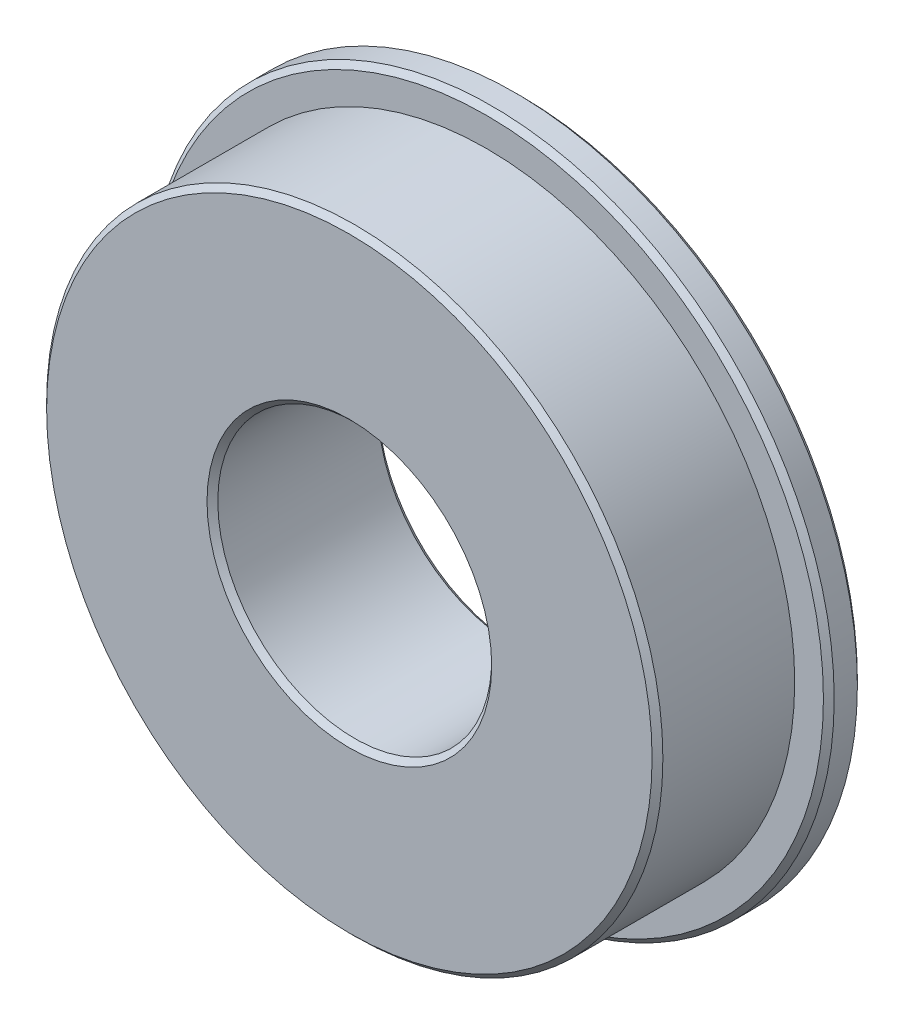
ISO-10303-21;
HEADER;
FILE_DESCRIPTION(('STEP AP214'),'2;1');
FILE_NAME('part.step','',(''),(''),'','','');
FILE_SCHEMA(('AUTOMOTIVE_DESIGN { 1 0 10303 214 1 1 1 1 }'));
ENDSEC;
DATA;
#1=APPLICATION_CONTEXT('core data for automotive mechanical design processes');
#2=APPLICATION_PROTOCOL_DEFINITION('international standard','automotive_design',2000,#1);
#3=PRODUCT_CONTEXT('',#1,'mechanical');
#4=PRODUCT('Part','Part','',(#3));
#5=PRODUCT_RELATED_PRODUCT_CATEGORY('part','',(#4));
#6=PRODUCT_DEFINITION_FORMATION('','',#4);
#7=PRODUCT_DEFINITION_CONTEXT('part definition',#1,'design');
#8=PRODUCT_DEFINITION('design','',#6,#7);
#9=PRODUCT_DEFINITION_SHAPE('','',#8);
#10=(LENGTH_UNIT() NAMED_UNIT(*) SI_UNIT(.MILLI.,.METRE.));
#11=(NAMED_UNIT(*) PLANE_ANGLE_UNIT() SI_UNIT($,.RADIAN.));
#12=(NAMED_UNIT(*) SI_UNIT($,.STERADIAN.) SOLID_ANGLE_UNIT());
#13=UNCERTAINTY_MEASURE_WITH_UNIT(LENGTH_MEASURE(1.E-05),#10,'distance_accuracy_value','');
#14=(GEOMETRIC_REPRESENTATION_CONTEXT(3) GLOBAL_UNCERTAINTY_ASSIGNED_CONTEXT((#13)) GLOBAL_UNIT_ASSIGNED_CONTEXT((#10,
#11,#12)) REPRESENTATION_CONTEXT('',''));
#15=CARTESIAN_POINT('',(0.,0.,0.));
#16=DIRECTION('',(0.,0.,1.));
#17=DIRECTION('',(1.,0.,0.));
#18=AXIS2_PLACEMENT_3D('',#15,#16,#17);
#19=CARTESIAN_POINT('',(-15.8687544862297,0.,-6.36269929073161));
#20=DIRECTION('',(0.,0.,-1.));
#21=DIRECTION('',(-1.,0.,0.));
#22=AXIS2_PLACEMENT_3D('',#19,#20,#21);
#23=PLANE('',#22);
#24=CARTESIAN_POINT('',(0.,0.,-6.36269929073161));
#25=DIRECTION('',(0.,0.,-1.));
#26=DIRECTION('',(-1.,0.,0.));
#27=AXIS2_PLACEMENT_3D('',#24,#25,#26);
#28=CIRCLE('',#27,15.6187544862297);
#29=CARTESIAN_POINT('',(-15.6187544862297,0.,-6.36269929073161));
#30=VERTEX_POINT('',#29);
#31=EDGE_CURVE('E10',#30,#30,#28,.F.);
#32=ORIENTED_EDGE('',*,*,#31,.T.);
#33=EDGE_LOOP('',(#32));
#34=FACE_BOUND('',#33,.T.);
#35=CARTESIAN_POINT('',(0.,0.,-6.36269929073161));
#36=DIRECTION('',(0.,0.,1.));
#37=DIRECTION('',(1.,0.,0.));
#38=AXIS2_PLACEMENT_3D('',#35,#36,#37);
#39=CIRCLE('',#38,14.2874972889093);
#40=CARTESIAN_POINT('',(14.2874972889093,0.,-6.36269929073161));
#41=VERTEX_POINT('',#40);
#42=EDGE_CURVE('E72',#41,#41,#39,.T.);
#43=ORIENTED_EDGE('',*,*,#42,.F.);
#44=EDGE_LOOP('',(#43));
#45=FACE_BOUND('',#44,.T.);
#46=ADVANCED_FACE('F34',(#34,#45),#23,.F.);
#47=CARTESIAN_POINT('',(0.,0.,0.));
#48=DIRECTION('',(0.,0.,1.));
#49=DIRECTION('',(1.,0.,0.));
#50=AXIS2_PLACEMENT_3D('',#47,#48,#49);
#51=CYLINDRICAL_SURFACE('',#50,15.8687544862297);
#52=CARTESIAN_POINT('',(0.,0.,-7.6874992907315));
#53=DIRECTION('',(0.,0.,1.));
#54=DIRECTION('',(1.,0.,0.));
#55=AXIS2_PLACEMENT_3D('',#52,#53,#54);
#56=CIRCLE('',#55,15.8687544862297);
#57=CARTESIAN_POINT('',(15.8687544862297,0.,-7.6874992907315));
#58=VERTEX_POINT('',#57);
#59=EDGE_CURVE('E41',#58,#58,#56,.T.);
#60=ORIENTED_EDGE('',*,*,#59,.T.);
#61=EDGE_LOOP('',(#60));
#62=FACE_BOUND('',#61,.T.);
#63=CARTESIAN_POINT('',(0.,0.,-6.61269929073161));
#64=DIRECTION('',(0.,0.,-1.));
#65=DIRECTION('',(-1.,0.,0.));
#66=AXIS2_PLACEMENT_3D('',#63,#64,#65);
#67=CIRCLE('',#66,15.8687544862297);
#68=CARTESIAN_POINT('',(-15.8687544862297,0.,-6.61269929073161));
#69=VERTEX_POINT('',#68);
#70=EDGE_CURVE('E45',#69,#69,#67,.T.);
#71=ORIENTED_EDGE('',*,*,#70,.T.);
#72=EDGE_LOOP('',(#71));
#73=FACE_BOUND('',#72,.T.);
#74=ADVANCED_FACE('F79',(#62,#73),#51,.T.);
#75=CARTESIAN_POINT('',(-6.34999793673862,0.,-7.93749929073151));
#76=DIRECTION('',(0.,0.,1.));
#77=DIRECTION('',(1.,0.,0.));
#78=AXIS2_PLACEMENT_3D('',#75,#76,#77);
#79=PLANE('',#78);
#80=CARTESIAN_POINT('',(0.,0.,-7.93749929073151));
#81=DIRECTION('',(0.,0.,1.));
#82=DIRECTION('',(1.,0.,0.));
#83=AXIS2_PLACEMENT_3D('',#80,#81,#82);
#84=CIRCLE('',#83,6.59999793673864);
#85=CARTESIAN_POINT('',(-6.59999793673864,0.,-7.93749929073151));
#86=VERTEX_POINT('',#85);
#87=EDGE_CURVE('E49',#86,#86,#84,.T.);
#88=ORIENTED_EDGE('',*,*,#87,.T.);
#89=EDGE_LOOP('',(#88));
#90=FACE_BOUND('',#89,.T.);
#91=CARTESIAN_POINT('',(0.,0.,-7.93749929073151));
#92=DIRECTION('',(0.,0.,1.));
#93=DIRECTION('',(1.,0.,0.));
#94=AXIS2_PLACEMENT_3D('',#91,#92,#93);
#95=CIRCLE('',#94,15.6187544862297);
#96=CARTESIAN_POINT('',(15.6187544862297,0.,-7.93749929073151));
#97=VERTEX_POINT('',#96);
#98=EDGE_CURVE('E54',#97,#97,#95,.F.);
#99=ORIENTED_EDGE('',*,*,#98,.T.);
#100=EDGE_LOOP('',(#99));
#101=FACE_BOUND('',#100,.T.);
#102=ADVANCED_FACE('F84',(#90,#101),#79,.F.);
#103=CARTESIAN_POINT('',(0.,0.,0.));
#104=DIRECTION('',(0.,0.,1.));
#105=DIRECTION('',(1.,0.,0.));
#106=AXIS2_PLACEMENT_3D('',#103,#104,#105);
#107=CYLINDRICAL_SURFACE('',#106,6.34999793673862);
#108=CARTESIAN_POINT('',(0.,0.,-0.250000000000004));
#109=DIRECTION('',(0.,0.,-1.));
#110=DIRECTION('',(-1.,0.,0.));
#111=AXIS2_PLACEMENT_3D('',#108,#109,#110);
#112=CIRCLE('',#111,6.34999793673862);
#113=CARTESIAN_POINT('',(-6.34999793673862,0.,-0.250000000000004));
#114=VERTEX_POINT('',#113);
#115=EDGE_CURVE('E66',#114,#114,#112,.F.);
#116=ORIENTED_EDGE('',*,*,#115,.T.);
#117=EDGE_LOOP('',(#116));
#118=FACE_BOUND('',#117,.T.);
#119=CARTESIAN_POINT('',(0.,0.,-7.6874992907315));
#120=DIRECTION('',(0.,0.,1.));
#121=DIRECTION('',(1.,0.,0.));
#122=AXIS2_PLACEMENT_3D('',#119,#120,#121);
#123=CIRCLE('',#122,6.34999793673862);
#124=CARTESIAN_POINT('',(-6.34999793673862,0.,-7.6874992907315));
#125=VERTEX_POINT('',#124);
#126=EDGE_CURVE('E69',#125,#125,#123,.F.);
#127=ORIENTED_EDGE('',*,*,#126,.T.);
#128=EDGE_LOOP('',(#127));
#129=FACE_BOUND('',#128,.T.);
#130=ADVANCED_FACE('F110',(#118,#129),#107,.F.);
#131=CARTESIAN_POINT('',(-14.2874972889093,0.,0.));
#132=DIRECTION('',(0.,0.,-1.));
#133=DIRECTION('',(-1.,0.,0.));
#134=AXIS2_PLACEMENT_3D('',#131,#132,#133);
#135=PLANE('',#134);
#136=CARTESIAN_POINT('',(0.,0.,0.));
#137=DIRECTION('',(0.,0.,-1.));
#138=DIRECTION('',(-1.,0.,0.));
#139=AXIS2_PLACEMENT_3D('',#136,#137,#138);
#140=CIRCLE('',#139,6.59999793673863);
#141=CARTESIAN_POINT('',(-6.59999793673863,0.,0.));
#142=VERTEX_POINT('',#141);
#143=EDGE_CURVE('E60',#142,#142,#140,.T.);
#144=ORIENTED_EDGE('',*,*,#143,.T.);
#145=EDGE_LOOP('',(#144));
#146=FACE_BOUND('',#145,.T.);
#147=CARTESIAN_POINT('',(0.,0.,0.));
#148=DIRECTION('',(0.,0.,-1.));
#149=DIRECTION('',(-1.,0.,0.));
#150=AXIS2_PLACEMENT_3D('',#147,#148,#149);
#151=CIRCLE('',#150,14.0374972889093);
#152=CARTESIAN_POINT('',(-14.0374972889093,0.,0.));
#153=VERTEX_POINT('',#152);
#154=EDGE_CURVE('E63',#153,#153,#151,.F.);
#155=ORIENTED_EDGE('',*,*,#154,.T.);
#156=EDGE_LOOP('',(#155));
#157=FACE_BOUND('',#156,.T.);
#158=ADVANCED_FACE('F115',(#146,#157),#135,.F.);
#159=CARTESIAN_POINT('',(0.,0.,0.));
#160=DIRECTION('',(0.,0.,1.));
#161=DIRECTION('',(1.,0.,0.));
#162=AXIS2_PLACEMENT_3D('',#159,#160,#161);
#163=CYLINDRICAL_SURFACE('',#162,14.2874972889093);
#164=CARTESIAN_POINT('',(0.,0.,-0.250000000000009));
#165=DIRECTION('',(0.,0.,-1.));
#166=DIRECTION('',(-1.,0.,0.));
#167=AXIS2_PLACEMENT_3D('',#164,#165,#166);
#168=CIRCLE('',#167,14.2874972889093);
#169=CARTESIAN_POINT('',(-14.2874972889093,0.,-0.250000000000009));
#170=VERTEX_POINT('',#169);
#171=EDGE_CURVE('E57',#170,#170,#168,.T.);
#172=ORIENTED_EDGE('',*,*,#171,.T.);
#173=EDGE_LOOP('',(#172));
#174=FACE_BOUND('',#173,.T.);
#175=ORIENTED_EDGE('',*,*,#42,.T.);
#176=EDGE_LOOP('',(#175));
#177=FACE_BOUND('',#176,.T.);
#178=ADVANCED_FACE('F76',(#174,#177),#163,.T.);
#179=CARTESIAN_POINT('',(0.,0.,-0.250000000000004));
#180=DIRECTION('',(0.,0.,1.));
#181=DIRECTION('',(1.,0.,0.));
#182=AXIS2_PLACEMENT_3D('',#179,#180,#181);
#183=CONICAL_SURFACE('',#182,6.34999793673862,0.785398163397447);
#184=ORIENTED_EDGE('',*,*,#143,.F.);
#185=EDGE_LOOP('',(#184));
#186=FACE_BOUND('',#185,.T.);
#187=ORIENTED_EDGE('',*,*,#115,.F.);
#188=EDGE_LOOP('',(#187));
#189=FACE_BOUND('',#188,.T.);
#190=ADVANCED_FACE('F88',(#186,#189),#183,.F.);
#191=CARTESIAN_POINT('',(0.,0.,0.));
#192=DIRECTION('',(0.,0.,-1.));
#193=DIRECTION('',(-1.,0.,0.));
#194=AXIS2_PLACEMENT_3D('',#191,#192,#193);
#195=CONICAL_SURFACE('',#194,14.0374972889093,0.785398163397462);
#196=ORIENTED_EDGE('',*,*,#171,.F.);
#197=EDGE_LOOP('',(#196));
#198=FACE_BOUND('',#197,.T.);
#199=ORIENTED_EDGE('',*,*,#154,.F.);
#200=EDGE_LOOP('',(#199));
#201=FACE_BOUND('',#200,.T.);
#202=ADVANCED_FACE('F91',(#198,#201),#195,.T.);
#203=CARTESIAN_POINT('',(0.,0.,-7.93749929073151));
#204=DIRECTION('',(0.,0.,-1.));
#205=DIRECTION('',(-1.,0.,0.));
#206=AXIS2_PLACEMENT_3D('',#203,#204,#205);
#207=CONICAL_SURFACE('',#206,6.59999793673864,0.78539816339745);
#208=CARTESIAN_POINT('',(-6.34999793673862,0.,-7.6874992907315));
#209=CARTESIAN_POINT('',(-6.35260210340529,0.,-7.69010345739817));
#210=CARTESIAN_POINT('',(-6.35520627007196,0.,-7.69270762406484));
#211=CARTESIAN_POINT('',(-6.36041460340529,0.,-7.69791595739817));
#212=CARTESIAN_POINT('',(-6.36301877007196,0.,-7.70052012406484));
#213=CARTESIAN_POINT('',(-6.36822710340529,0.,-7.70572845739817));
#214=CARTESIAN_POINT('',(-6.37083127007196,0.,-7.70833262406484));
#215=CARTESIAN_POINT('',(-6.37603960340529,0.,-7.71354095739817));
#216=CARTESIAN_POINT('',(-6.37864377007196,0.,-7.71614512406484));
#217=CARTESIAN_POINT('',(-6.38385210340529,0.,-7.72135345739817));
#218=CARTESIAN_POINT('',(-6.38645627007196,0.,-7.72395762406484));
#219=CARTESIAN_POINT('',(-6.39166460340529,0.,-7.72916595739817));
#220=CARTESIAN_POINT('',(-6.39426877007196,0.,-7.73177012406484));
#221=CARTESIAN_POINT('',(-6.39947710340529,0.,-7.73697845739817));
#222=CARTESIAN_POINT('',(-6.40208127007196,0.,-7.73958262406484));
#223=CARTESIAN_POINT('',(-6.40728960340529,0.,-7.74479095739817));
#224=CARTESIAN_POINT('',(-6.40989377007196,0.,-7.74739512406484));
#225=CARTESIAN_POINT('',(-6.41510210340529,0.,-7.75260345739817));
#226=CARTESIAN_POINT('',(-6.41770627007196,0.,-7.75520762406484));
#227=CARTESIAN_POINT('',(-6.42291460340529,0.,-7.76041595739817));
#228=CARTESIAN_POINT('',(-6.42551877007196,0.,-7.76302012406484));
#229=CARTESIAN_POINT('',(-6.4307271034053,0.,-7.76822845739817));
#230=CARTESIAN_POINT('',(-6.43333127007196,0.,-7.77083262406484));
#231=CARTESIAN_POINT('',(-6.4385396034053,0.,-7.77604095739817));
#232=CARTESIAN_POINT('',(-6.44114377007196,0.,-7.77864512406484));
#233=CARTESIAN_POINT('',(-6.4463521034053,0.,-7.78385345739817));
#234=CARTESIAN_POINT('',(-6.44895627007196,0.,-7.78645762406484));
#235=CARTESIAN_POINT('',(-6.4541646034053,0.,-7.79166595739817));
#236=CARTESIAN_POINT('',(-6.45676877007196,0.,-7.79427012406484));
#237=CARTESIAN_POINT('',(-6.4619771034053,0.,-7.79947845739817));
#238=CARTESIAN_POINT('',(-6.46458127007196,0.,-7.80208262406484));
#239=CARTESIAN_POINT('',(-6.4697896034053,0.,-7.80729095739817));
#240=CARTESIAN_POINT('',(-6.47239377007196,0.,-7.80989512406484));
#241=CARTESIAN_POINT('',(-6.4776021034053,0.,-7.81510345739818));
#242=CARTESIAN_POINT('',(-6.48020627007196,0.,-7.81770762406484));
#243=CARTESIAN_POINT('',(-6.4854146034053,0.,-7.82291595739817));
#244=CARTESIAN_POINT('',(-6.48801877007196,0.,-7.82552012406484));
#245=CARTESIAN_POINT('',(-6.4932271034053,0.,-7.83072845739818));
#246=CARTESIAN_POINT('',(-6.49583127007196,0.,-7.83333262406484));
#247=CARTESIAN_POINT('',(-6.5010396034053,0.,-7.83854095739818));
#248=CARTESIAN_POINT('',(-6.50364377007197,0.,-7.84114512406484));
#249=CARTESIAN_POINT('',(-6.5088521034053,0.,-7.84635345739818));
#250=CARTESIAN_POINT('',(-6.51145627007197,0.,-7.84895762406484));
#251=CARTESIAN_POINT('',(-6.5166646034053,0.,-7.85416595739818));
#252=CARTESIAN_POINT('',(-6.51926877007197,0.,-7.85677012406484));
#253=CARTESIAN_POINT('',(-6.5244771034053,0.,-7.86197845739818));
#254=CARTESIAN_POINT('',(-6.52708127007197,0.,-7.86458262406484));
#255=CARTESIAN_POINT('',(-6.5322896034053,0.,-7.86979095739818));
#256=CARTESIAN_POINT('',(-6.53489377007197,0.,-7.87239512406484));
#257=CARTESIAN_POINT('',(-6.5401021034053,0.,-7.87760345739818));
#258=CARTESIAN_POINT('',(-6.54270627007197,0.,-7.88020762406485));
#259=CARTESIAN_POINT('',(-6.5479146034053,0.,-7.88541595739818));
#260=CARTESIAN_POINT('',(-6.55051877007197,0.,-7.88802012406484));
#261=CARTESIAN_POINT('',(-6.5557271034053,0.,-7.89322845739818));
#262=CARTESIAN_POINT('',(-6.55833127007197,0.,-7.89583262406485));
#263=CARTESIAN_POINT('',(-6.5635396034053,0.,-7.90104095739818));
#264=CARTESIAN_POINT('',(-6.56614377007197,0.,-7.90364512406485));
#265=CARTESIAN_POINT('',(-6.5713521034053,0.,-7.90885345739818));
#266=CARTESIAN_POINT('',(-6.57395627007197,0.,-7.91145762406485));
#267=CARTESIAN_POINT('',(-6.5791646034053,0.,-7.91666595739818));
#268=CARTESIAN_POINT('',(-6.58176877007197,0.,-7.91927012406485));
#269=CARTESIAN_POINT('',(-6.5869771034053,0.,-7.92447845739818));
#270=CARTESIAN_POINT('',(-6.58958127007197,0.,-7.92708262406485));
#271=CARTESIAN_POINT('',(-6.5947896034053,0.,-7.93229095739818));
#272=CARTESIAN_POINT('',(-6.59739377007197,0.,-7.93489512406485));
#273=CARTESIAN_POINT('',(-6.59999793673864,0.,-7.93749929073151));
#274=B_SPLINE_CURVE_WITH_KNOTS('',3,(#208,#209,#210,#211,#212,#213,#214,#215,#216,#217,#218,
#219,#220,#221,#222,#223,#224,#225,#226,#227,#228,#229,#230,#231,#232,#233,#234,#235,#236,#237,
#238,#239,#240,#241,#242,#243,#244,#245,#246,#247,#248,#249,#250,#251,#252,#253,#254,#255,#256,
#257,#258,#259,#260,#261,#262,#263,#264,#265,#266,#267,#268,#269,#270,#271,#272,#273),
.UNSPECIFIED.,.F.,.F.,(4,2,2,2,2,2,2,2,2,2,2,2,2,2,2,2,2,2,2,2,2,2,2,2,2,2,2,2,2,2,2,2,4),(0.,
0.011048543456041,0.0220970869120809,0.0331456303681219,0.0441941738241617,0.0552427172802015,
0.0662912607362426,0.0773398041922824,0.0883883476483222,0.0994368911043632,0.110485434560403,
0.121533978016444,0.132582521472484,0.143631064928524,0.154679608384564,0.165728151840605,
0.176776695296645,0.187825238752685,0.198873782208725,0.209922325664766,0.220970869120805,
0.232019412576846,0.243067956032887,0.254116499488926,0.265165042944967,0.276213586401008,
0.287262129857047,0.298310673313088,0.309359216769128,0.320407760225168,0.331456303681208,
0.34250484713725,0.353553390593289),.UNSPECIFIED.);
#275=EDGE_CURVE('BSEAM95',#125,#86,#274,.T.);
#276=ORIENTED_EDGE('',*,*,#126,.F.);
#277=ORIENTED_EDGE('',*,*,#87,.F.);
#278=ORIENTED_EDGE('',*,*,#275,.T.);
#279=ORIENTED_EDGE('',*,*,#275,.F.);
#280=EDGE_LOOP('',(#276,#278,#277,#279));
#281=FACE_BOUND('',#280,.T.);
#282=ADVANCED_FACE('F95',(#281),#207,.F.);
#283=CARTESIAN_POINT('',(0.,0.,-7.6874992907315));
#284=DIRECTION('',(0.,0.,1.));
#285=DIRECTION('',(1.,0.,0.));
#286=AXIS2_PLACEMENT_3D('',#283,#284,#285);
#287=CONICAL_SURFACE('',#286,15.8687544862297,0.785398163397462);
#288=ORIENTED_EDGE('',*,*,#98,.F.);
#289=EDGE_LOOP('',(#288));
#290=FACE_BOUND('',#289,.T.);
#291=ORIENTED_EDGE('',*,*,#59,.F.);
#292=EDGE_LOOP('',(#291));
#293=FACE_BOUND('',#292,.T.);
#294=ADVANCED_FACE('F98',(#290,#293),#287,.T.);
#295=CARTESIAN_POINT('',(0.,0.,-6.36269929073161));
#296=DIRECTION('',(0.,0.,-1.));
#297=DIRECTION('',(-1.,0.,0.));
#298=AXIS2_PLACEMENT_3D('',#295,#296,#297);
#299=CONICAL_SURFACE('',#298,15.6187544862297,0.785398163397448);
#300=ORIENTED_EDGE('',*,*,#70,.F.);
#301=EDGE_LOOP('',(#300));
#302=FACE_BOUND('',#301,.T.);
#303=ORIENTED_EDGE('',*,*,#31,.F.);
#304=EDGE_LOOP('',(#303));
#305=FACE_BOUND('',#304,.T.);
#306=ADVANCED_FACE('F36',(#302,#305),#299,.T.);
#307=CLOSED_SHELL('',(#46,#74,#102,#130,#158,#178,#190,#202,#282,#294,#306));
#308=MANIFOLD_SOLID_BREP('B2',#307);
#309=ADVANCED_BREP_SHAPE_REPRESENTATION('',(#18,#308),#14);
#310=SHAPE_DEFINITION_REPRESENTATION(#9,#309);
ENDSEC;
END-ISO-10303-21;
